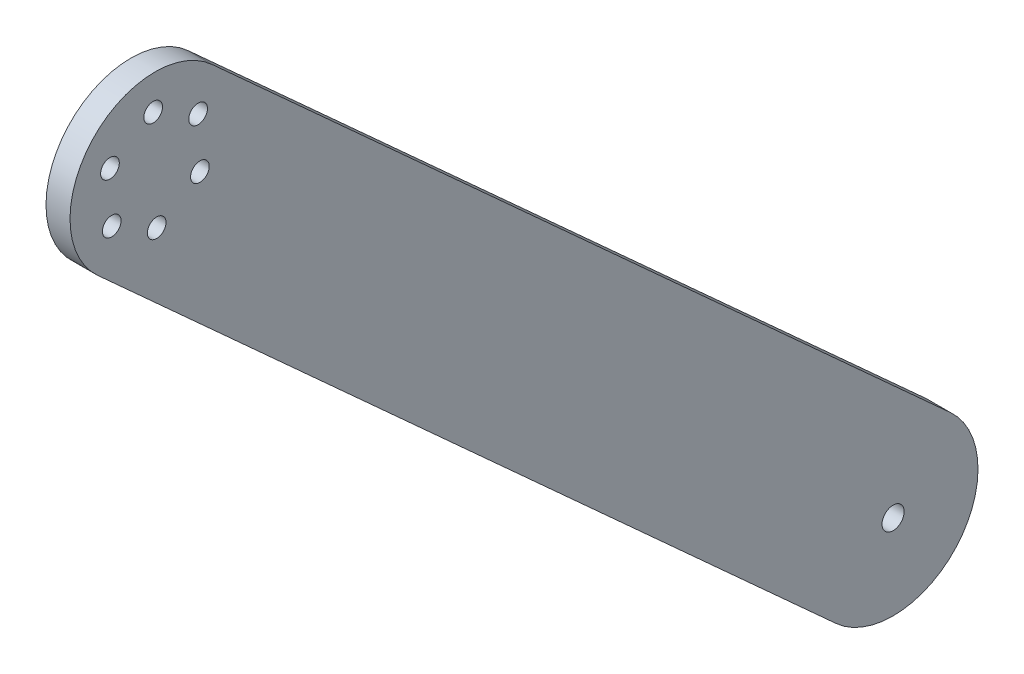
ISO-10303-21;
HEADER;
FILE_DESCRIPTION(('STEP AP214'),'2;1');
FILE_NAME('part.step','',(''),(''),'','','');
FILE_SCHEMA(('AUTOMOTIVE_DESIGN { 1 0 10303 214 1 1 1 1 }'));
ENDSEC;
DATA;
#1=APPLICATION_CONTEXT('core data for automotive mechanical design processes');
#2=APPLICATION_PROTOCOL_DEFINITION('international standard','automotive_design',2000,#1);
#3=PRODUCT_CONTEXT('',#1,'mechanical');
#4=PRODUCT('Part','Part','',(#3));
#5=PRODUCT_RELATED_PRODUCT_CATEGORY('part','',(#4));
#6=PRODUCT_DEFINITION_FORMATION('','',#4);
#7=PRODUCT_DEFINITION_CONTEXT('part definition',#1,'design');
#8=PRODUCT_DEFINITION('design','',#6,#7);
#9=PRODUCT_DEFINITION_SHAPE('','',#8);
#10=(LENGTH_UNIT() NAMED_UNIT(*) SI_UNIT(.MILLI.,.METRE.));
#11=(NAMED_UNIT(*) PLANE_ANGLE_UNIT() SI_UNIT($,.RADIAN.));
#12=(NAMED_UNIT(*) SI_UNIT($,.STERADIAN.) SOLID_ANGLE_UNIT());
#13=UNCERTAINTY_MEASURE_WITH_UNIT(LENGTH_MEASURE(1.E-05),#10,'distance_accuracy_value','');
#14=(GEOMETRIC_REPRESENTATION_CONTEXT(3) GLOBAL_UNCERTAINTY_ASSIGNED_CONTEXT((#13)) GLOBAL_UNIT_ASSIGNED_CONTEXT((#10,
#11,#12)) REPRESENTATION_CONTEXT('',''));
#15=CARTESIAN_POINT('',(0.,0.,0.));
#16=DIRECTION('',(0.,0.,1.));
#17=DIRECTION('',(1.,0.,0.));
#18=AXIS2_PLACEMENT_3D('',#15,#16,#17);
#19=CARTESIAN_POINT('',(5.661,78.9641500156706,86.9434615845416));
#20=DIRECTION('',(1.,0.,0.));
#21=DIRECTION('',(0.,0.,-1.));
#22=AXIS2_PLACEMENT_3D('',#19,#20,#21);
#23=PLANE('',#22);
#24=CARTESIAN_POINT('',(5.661,73.3262866783321,76.3503271574944));
#25=DIRECTION('',(1.,0.,0.));
#26=DIRECTION('',(0.,0.,-1.));
#27=AXIS2_PLACEMENT_3D('',#24,#25,#26);
#28=CIRCLE('',#27,2.2);
#29=CARTESIAN_POINT('',(5.661,73.3262866783321,74.1503271574944));
#30=VERTEX_POINT('',#29);
#31=EDGE_CURVE('E147',#30,#30,#28,.T.);
#32=ORIENTED_EDGE('',*,*,#31,.F.);
#33=EDGE_LOOP('',(#32));
#34=FACE_BOUND('',#33,.T.);
#35=CARTESIAN_POINT('',(5.661,90.9570052038663,87.3574959248652));
#36=DIRECTION('',(1.,0.,0.));
#37=DIRECTION('',(0.,0.,-1.));
#38=AXIS2_PLACEMENT_3D('',#35,#36,#37);
#39=CIRCLE('',#38,2.2);
#40=CARTESIAN_POINT('',(5.661,90.9570052038663,85.1574959248652));
#41=VERTEX_POINT('',#40);
#42=EDGE_CURVE('E135',#41,#41,#39,.T.);
#43=ORIENTED_EDGE('',*,*,#42,.F.);
#44=EDGE_LOOP('',(#43));
#45=FACE_BOUND('',#44,.T.);
#46=CARTESIAN_POINT('',(5.661,72.6091581648133,97.1225616712653));
#47=DIRECTION('',(1.,0.,0.));
#48=DIRECTION('',(0.,0.,-1.));
#49=AXIS2_PLACEMENT_3D('',#46,#47,#48);
#50=CIRCLE('',#49,2.2);
#51=CARTESIAN_POINT('',(5.661,72.6091581648133,94.9225616712653));
#52=VERTEX_POINT('',#51);
#53=EDGE_CURVE('E123',#52,#52,#50,.T.);
#54=ORIENTED_EDGE('',*,*,#53,.F.);
#55=EDGE_LOOP('',(#54));
#56=FACE_BOUND('',#55,.T.);
#57=CARTESIAN_POINT('',(5.661,78.9641500156706,86.9434615845416));
#58=DIRECTION('',(1.,0.,0.));
#59=DIRECTION('',(0.,0.,-1.));
#60=AXIS2_PLACEMENT_3D('',#57,#58,#59);
#61=CIRCLE('',#60,20.);
#62=CARTESIAN_POINT('',(5.661,93.7693371735321,73.4970333145254));
#63=VERTEX_POINT('',#62);
#64=CARTESIAN_POINT('',(5.661,64.158962857809,100.389889854558));
#65=VERTEX_POINT('',#64);
#66=EDGE_CURVE('E93',#63,#65,#61,.T.);
#67=ORIENTED_EDGE('',*,*,#66,.T.);
#68=DIRECTION('',(0.,-0.672321413500814,-0.740259357893075));
#69=VECTOR('',#68,1.);
#70=CARTESIAN_POINT('',(5.661,64.158962857809,100.389889854558));
#71=LINE('',#70,#69);
#72=CARTESIAN_POINT('',(5.661,-93.769337173532,-73.4970333145254));
#73=VERTEX_POINT('',#72);
#74=EDGE_CURVE('E88',#65,#73,#71,.T.);
#75=ORIENTED_EDGE('',*,*,#74,.T.);
#76=CARTESIAN_POINT('',(5.661,-78.9641500156705,-86.9434615845417));
#77=DIRECTION('',(1.,0.,0.));
#78=DIRECTION('',(0.,0.,-1.));
#79=AXIS2_PLACEMENT_3D('',#76,#77,#78);
#80=CIRCLE('',#79,20.);
#81=CARTESIAN_POINT('',(5.661,-64.1589628578091,-100.389889854558));
#82=VERTEX_POINT('',#81);
#83=EDGE_CURVE('E91',#73,#82,#80,.T.);
#84=ORIENTED_EDGE('',*,*,#83,.T.);
#85=DIRECTION('',(0.,0.672321413500814,0.740259357893075));
#86=VECTOR('',#85,1.);
#87=CARTESIAN_POINT('',(5.661,93.7693371735321,73.4970333145254));
#88=LINE('',#87,#86);
#89=EDGE_CURVE('E58',#82,#63,#88,.T.);
#90=ORIENTED_EDGE('',*,*,#89,.T.);
#91=EDGE_LOOP('',(#67,#75,#84,#90));
#92=FACE_BOUND('',#91,.T.);
#93=CARTESIAN_POINT('',(5.661,-78.9641500156705,-86.9434615845417));
#94=DIRECTION('',(1.,0.,0.));
#95=DIRECTION('',(0.,0.,-1.));
#96=AXIS2_PLACEMENT_3D('',#93,#94,#95);
#97=CIRCLE('',#96,2.60670000000001);
#98=CARTESIAN_POINT('',(5.661,-78.9641500156705,-89.5501615845417));
#99=VERTEX_POINT('',#98);
#100=EDGE_CURVE('E108',#99,#99,#97,.T.);
#101=ORIENTED_EDGE('',*,*,#100,.F.);
#102=EDGE_LOOP('',(#101));
#103=FACE_BOUND('',#102,.T.);
#104=CARTESIAN_POINT('',(5.661,84.602013353009,97.5365960115889));
#105=DIRECTION('',(1.,0.,0.));
#106=DIRECTION('',(0.,0.,-1.));
#107=AXIS2_PLACEMENT_3D('',#104,#105,#106);
#108=CIRCLE('',#107,2.2);
#109=CARTESIAN_POINT('',(5.661,84.602013353009,95.3365960115889));
#110=VERTEX_POINT('',#109);
#111=EDGE_CURVE('E129',#110,#110,#108,.T.);
#112=ORIENTED_EDGE('',*,*,#111,.F.);
#113=EDGE_LOOP('',(#112));
#114=FACE_BOUND('',#113,.T.);
#115=CARTESIAN_POINT('',(5.661,85.3191418665278,76.7643614978179));
#116=DIRECTION('',(1.,0.,0.));
#117=DIRECTION('',(0.,0.,-1.));
#118=AXIS2_PLACEMENT_3D('',#115,#116,#117);
#119=CIRCLE('',#118,2.2);
#120=CARTESIAN_POINT('',(5.661,85.3191418665278,74.5643614978179));
#121=VERTEX_POINT('',#120);
#122=EDGE_CURVE('E141',#121,#121,#119,.T.);
#123=ORIENTED_EDGE('',*,*,#122,.F.);
#124=EDGE_LOOP('',(#123));
#125=FACE_BOUND('',#124,.T.);
#126=CARTESIAN_POINT('',(5.661,66.9712948274749,86.5294272442181));
#127=DIRECTION('',(1.,0.,0.));
#128=DIRECTION('',(0.,0.,-1.));
#129=AXIS2_PLACEMENT_3D('',#126,#127,#128);
#130=CIRCLE('',#129,2.2);
#131=CARTESIAN_POINT('',(5.661,66.9712948274749,84.3294272442181));
#132=VERTEX_POINT('',#131);
#133=EDGE_CURVE('E153',#132,#132,#130,.T.);
#134=ORIENTED_EDGE('',*,*,#133,.F.);
#135=EDGE_LOOP('',(#134));
#136=FACE_BOUND('',#135,.T.);
#137=ADVANCED_FACE('F41',(#34,#45,#56,#92,#103,#114,#125,#136),#23,.T.);
#138=CARTESIAN_POINT('',(0.,78.9641500156706,86.9434615845416));
#139=DIRECTION('',(1.,0.,0.));
#140=DIRECTION('',(0.,0.,-1.));
#141=AXIS2_PLACEMENT_3D('',#138,#139,#140);
#142=PLANE('',#141);
#143=CARTESIAN_POINT('',(0.,78.9641500156706,86.9434615845416));
#144=DIRECTION('',(1.,0.,0.));
#145=DIRECTION('',(0.,0.,-1.));
#146=AXIS2_PLACEMENT_3D('',#143,#144,#145);
#147=CIRCLE('',#146,20.);
#148=CARTESIAN_POINT('',(0.,93.7693371735321,73.4970333145254));
#149=VERTEX_POINT('',#148);
#150=CARTESIAN_POINT('',(0.,64.158962857809,100.389889854558));
#151=VERTEX_POINT('',#150);
#152=EDGE_CURVE('E105',#149,#151,#147,.T.);
#153=ORIENTED_EDGE('',*,*,#152,.F.);
#154=DIRECTION('',(0.,0.672321413500814,0.740259357893075));
#155=VECTOR('',#154,1.);
#156=CARTESIAN_POINT('',(0.,93.7693371735321,73.4970333145254));
#157=LINE('',#156,#155);
#158=CARTESIAN_POINT('',(0.,-64.1589628578091,-100.389889854558));
#159=VERTEX_POINT('',#158);
#160=EDGE_CURVE('E81',#159,#149,#157,.T.);
#161=ORIENTED_EDGE('',*,*,#160,.F.);
#162=CARTESIAN_POINT('',(0.,-78.9641500156705,-86.9434615845417));
#163=DIRECTION('',(1.,0.,0.));
#164=DIRECTION('',(0.,0.,-1.));
#165=AXIS2_PLACEMENT_3D('',#162,#163,#164);
#166=CIRCLE('',#165,20.);
#167=CARTESIAN_POINT('',(0.,-93.769337173532,-73.4970333145254));
#168=VERTEX_POINT('',#167);
#169=EDGE_CURVE('E75',#168,#159,#166,.T.);
#170=ORIENTED_EDGE('',*,*,#169,.F.);
#171=DIRECTION('',(0.,-0.672321413500814,-0.740259357893075));
#172=VECTOR('',#171,1.);
#173=CARTESIAN_POINT('',(0.,64.158962857809,100.389889854558));
#174=LINE('',#173,#172);
#175=EDGE_CURVE('E97',#151,#168,#174,.T.);
#176=ORIENTED_EDGE('',*,*,#175,.F.);
#177=EDGE_LOOP('',(#153,#161,#170,#176));
#178=FACE_BOUND('',#177,.T.);
#179=CARTESIAN_POINT('',(0.,-78.9641500156705,-86.9434615845417));
#180=DIRECTION('',(1.,0.,0.));
#181=DIRECTION('',(0.,0.,-1.));
#182=AXIS2_PLACEMENT_3D('',#179,#180,#181);
#183=CIRCLE('',#182,2.60670000000001);
#184=CARTESIAN_POINT('',(0.,-78.9641500156705,-89.5501615845417));
#185=VERTEX_POINT('',#184);
#186=EDGE_CURVE('E120',#185,#185,#183,.T.);
#187=ORIENTED_EDGE('',*,*,#186,.T.);
#188=EDGE_LOOP('',(#187));
#189=FACE_BOUND('',#188,.T.);
#190=CARTESIAN_POINT('',(0.,72.6091581648133,97.1225616712653));
#191=DIRECTION('',(1.,0.,0.));
#192=DIRECTION('',(0.,0.,-1.));
#193=AXIS2_PLACEMENT_3D('',#190,#191,#192);
#194=CIRCLE('',#193,2.2);
#195=CARTESIAN_POINT('',(0.,72.6091581648133,94.9225616712653));
#196=VERTEX_POINT('',#195);
#197=EDGE_CURVE('E126',#196,#196,#194,.T.);
#198=ORIENTED_EDGE('',*,*,#197,.T.);
#199=EDGE_LOOP('',(#198));
#200=FACE_BOUND('',#199,.T.);
#201=CARTESIAN_POINT('',(0.,84.602013353009,97.5365960115889));
#202=DIRECTION('',(1.,0.,0.));
#203=DIRECTION('',(0.,0.,-1.));
#204=AXIS2_PLACEMENT_3D('',#201,#202,#203);
#205=CIRCLE('',#204,2.2);
#206=CARTESIAN_POINT('',(0.,84.602013353009,95.3365960115889));
#207=VERTEX_POINT('',#206);
#208=EDGE_CURVE('E132',#207,#207,#205,.T.);
#209=ORIENTED_EDGE('',*,*,#208,.T.);
#210=EDGE_LOOP('',(#209));
#211=FACE_BOUND('',#210,.T.);
#212=CARTESIAN_POINT('',(0.,90.9570052038663,87.3574959248652));
#213=DIRECTION('',(1.,0.,0.));
#214=DIRECTION('',(0.,0.,-1.));
#215=AXIS2_PLACEMENT_3D('',#212,#213,#214);
#216=CIRCLE('',#215,2.2);
#217=CARTESIAN_POINT('',(0.,90.9570052038663,85.1574959248652));
#218=VERTEX_POINT('',#217);
#219=EDGE_CURVE('E138',#218,#218,#216,.T.);
#220=ORIENTED_EDGE('',*,*,#219,.T.);
#221=EDGE_LOOP('',(#220));
#222=FACE_BOUND('',#221,.T.);
#223=CARTESIAN_POINT('',(0.,85.3191418665278,76.7643614978179));
#224=DIRECTION('',(1.,0.,0.));
#225=DIRECTION('',(0.,0.,-1.));
#226=AXIS2_PLACEMENT_3D('',#223,#224,#225);
#227=CIRCLE('',#226,2.2);
#228=CARTESIAN_POINT('',(0.,85.3191418665278,74.5643614978179));
#229=VERTEX_POINT('',#228);
#230=EDGE_CURVE('E144',#229,#229,#227,.T.);
#231=ORIENTED_EDGE('',*,*,#230,.T.);
#232=EDGE_LOOP('',(#231));
#233=FACE_BOUND('',#232,.T.);
#234=CARTESIAN_POINT('',(0.,73.3262866783321,76.3503271574944));
#235=DIRECTION('',(1.,0.,0.));
#236=DIRECTION('',(0.,0.,-1.));
#237=AXIS2_PLACEMENT_3D('',#234,#235,#236);
#238=CIRCLE('',#237,2.2);
#239=CARTESIAN_POINT('',(0.,73.3262866783321,74.1503271574944));
#240=VERTEX_POINT('',#239);
#241=EDGE_CURVE('E150',#240,#240,#238,.T.);
#242=ORIENTED_EDGE('',*,*,#241,.T.);
#243=EDGE_LOOP('',(#242));
#244=FACE_BOUND('',#243,.T.);
#245=CARTESIAN_POINT('',(0.,66.9712948274749,86.5294272442181));
#246=DIRECTION('',(1.,0.,0.));
#247=DIRECTION('',(0.,0.,-1.));
#248=AXIS2_PLACEMENT_3D('',#245,#246,#247);
#249=CIRCLE('',#248,2.2);
#250=CARTESIAN_POINT('',(0.,66.9712948274749,84.3294272442181));
#251=VERTEX_POINT('',#250);
#252=EDGE_CURVE('E156',#251,#251,#249,.T.);
#253=ORIENTED_EDGE('',*,*,#252,.T.);
#254=EDGE_LOOP('',(#253));
#255=FACE_BOUND('',#254,.T.);
#256=ADVANCED_FACE('F116',(#178,#189,#200,#211,#222,#233,#244,#255),#142,.F.);
#257=CARTESIAN_POINT('',(5.661,78.9641500156706,86.9434615845416));
#258=DIRECTION('',(-1.,0.,0.));
#259=DIRECTION('',(0.,0.,1.));
#260=AXIS2_PLACEMENT_3D('',#257,#258,#259);
#261=CYLINDRICAL_SURFACE('',#260,20.);
#262=ORIENTED_EDGE('',*,*,#152,.T.);
#263=DIRECTION('',(-1.,0.,0.));
#264=VECTOR('',#263,1.);
#265=CARTESIAN_POINT('',(5.661,64.158962857809,100.389889854558));
#266=LINE('',#265,#264);
#267=EDGE_CURVE('E11',#65,#151,#266,.T.);
#268=ORIENTED_EDGE('',*,*,#267,.F.);
#269=ORIENTED_EDGE('',*,*,#66,.F.);
#270=DIRECTION('',(-1.,0.,0.));
#271=VECTOR('',#270,1.);
#272=CARTESIAN_POINT('',(5.661,93.7693371735321,73.4970333145254));
#273=LINE('',#272,#271);
#274=EDGE_CURVE('E101',#63,#149,#273,.T.);
#275=ORIENTED_EDGE('',*,*,#274,.T.);
#276=EDGE_LOOP('',(#262,#268,#269,#275));
#277=FACE_BOUND('',#276,.T.);
#278=ADVANCED_FACE('F43',(#277),#261,.T.);
#279=CARTESIAN_POINT('',(5.661,64.158962857809,100.389889854558));
#280=DIRECTION('',(0.,0.740259357893075,-0.672321413500814));
#281=DIRECTION('',(0.,0.672321413500814,0.740259357893075));
#282=AXIS2_PLACEMENT_3D('',#279,#280,#281);
#283=PLANE('',#282);
#284=ORIENTED_EDGE('',*,*,#175,.T.);
#285=DIRECTION('',(-1.,0.,0.));
#286=VECTOR('',#285,1.);
#287=CARTESIAN_POINT('',(5.661,-93.769337173532,-73.4970333145254));
#288=LINE('',#287,#286);
#289=EDGE_CURVE('E50',#73,#168,#288,.T.);
#290=ORIENTED_EDGE('',*,*,#289,.F.);
#291=ORIENTED_EDGE('',*,*,#74,.F.);
#292=ORIENTED_EDGE('',*,*,#267,.T.);
#293=EDGE_LOOP('',(#284,#290,#291,#292));
#294=FACE_BOUND('',#293,.T.);
#295=ADVANCED_FACE('F96',(#294),#283,.F.);
#296=CARTESIAN_POINT('',(5.661,-78.9641500156705,-86.9434615845417));
#297=DIRECTION('',(-1.,0.,0.));
#298=DIRECTION('',(0.,0.,1.));
#299=AXIS2_PLACEMENT_3D('',#296,#297,#298);
#300=CYLINDRICAL_SURFACE('',#299,20.);
#301=ORIENTED_EDGE('',*,*,#169,.T.);
#302=DIRECTION('',(-1.,0.,0.));
#303=VECTOR('',#302,1.);
#304=CARTESIAN_POINT('',(5.661,-64.1589628578091,-100.389889854558));
#305=LINE('',#304,#303);
#306=EDGE_CURVE('E98',#82,#159,#305,.T.);
#307=ORIENTED_EDGE('',*,*,#306,.F.);
#308=ORIENTED_EDGE('',*,*,#83,.F.);
#309=ORIENTED_EDGE('',*,*,#289,.T.);
#310=EDGE_LOOP('',(#301,#307,#308,#309));
#311=FACE_BOUND('',#310,.T.);
#312=ADVANCED_FACE('F99',(#311),#300,.T.);
#313=CARTESIAN_POINT('',(5.661,93.7693371735321,73.4970333145254));
#314=DIRECTION('',(0.,-0.740259357893075,0.672321413500814));
#315=DIRECTION('',(0.,-0.672321413500814,-0.740259357893075));
#316=AXIS2_PLACEMENT_3D('',#313,#314,#315);
#317=PLANE('',#316);
#318=ORIENTED_EDGE('',*,*,#160,.T.);
#319=ORIENTED_EDGE('',*,*,#274,.F.);
#320=ORIENTED_EDGE('',*,*,#89,.F.);
#321=ORIENTED_EDGE('',*,*,#306,.T.);
#322=EDGE_LOOP('',(#318,#319,#320,#321));
#323=FACE_BOUND('',#322,.T.);
#324=ADVANCED_FACE('F113',(#323),#317,.F.);
#325=CARTESIAN_POINT('',(5.661,-78.9641500156705,-86.9434615845417));
#326=DIRECTION('',(-1.,0.,0.));
#327=DIRECTION('',(0.,0.,1.));
#328=AXIS2_PLACEMENT_3D('',#325,#326,#327);
#329=CYLINDRICAL_SURFACE('',#328,2.60670000000001);
#330=ORIENTED_EDGE('',*,*,#100,.T.);
#331=EDGE_LOOP('',(#330));
#332=FACE_BOUND('',#331,.T.);
#333=ORIENTED_EDGE('',*,*,#186,.F.);
#334=EDGE_LOOP('',(#333));
#335=FACE_BOUND('',#334,.T.);
#336=ADVANCED_FACE('F175',(#332,#335),#329,.F.);
#337=CARTESIAN_POINT('',(5.661,72.6091581648133,97.1225616712653));
#338=DIRECTION('',(-1.,0.,0.));
#339=DIRECTION('',(0.,0.,1.));
#340=AXIS2_PLACEMENT_3D('',#337,#338,#339);
#341=CYLINDRICAL_SURFACE('',#340,2.2);
#342=ORIENTED_EDGE('',*,*,#53,.T.);
#343=EDGE_LOOP('',(#342));
#344=FACE_BOUND('',#343,.T.);
#345=ORIENTED_EDGE('',*,*,#197,.F.);
#346=EDGE_LOOP('',(#345));
#347=FACE_BOUND('',#346,.T.);
#348=ADVANCED_FACE('F220',(#344,#347),#341,.F.);
#349=CARTESIAN_POINT('',(5.661,84.602013353009,97.5365960115889));
#350=DIRECTION('',(-1.,0.,0.));
#351=DIRECTION('',(0.,0.,1.));
#352=AXIS2_PLACEMENT_3D('',#349,#350,#351);
#353=CYLINDRICAL_SURFACE('',#352,2.2);
#354=ORIENTED_EDGE('',*,*,#111,.T.);
#355=EDGE_LOOP('',(#354));
#356=FACE_BOUND('',#355,.T.);
#357=ORIENTED_EDGE('',*,*,#208,.F.);
#358=EDGE_LOOP('',(#357));
#359=FACE_BOUND('',#358,.T.);
#360=ADVANCED_FACE('F228',(#356,#359),#353,.F.);
#361=CARTESIAN_POINT('',(5.661,90.9570052038663,87.3574959248652));
#362=DIRECTION('',(-1.,0.,0.));
#363=DIRECTION('',(0.,0.,1.));
#364=AXIS2_PLACEMENT_3D('',#361,#362,#363);
#365=CYLINDRICAL_SURFACE('',#364,2.2);
#366=ORIENTED_EDGE('',*,*,#42,.T.);
#367=EDGE_LOOP('',(#366));
#368=FACE_BOUND('',#367,.T.);
#369=ORIENTED_EDGE('',*,*,#219,.F.);
#370=EDGE_LOOP('',(#369));
#371=FACE_BOUND('',#370,.T.);
#372=ADVANCED_FACE('F236',(#368,#371),#365,.F.);
#373=CARTESIAN_POINT('',(5.661,85.3191418665278,76.7643614978179));
#374=DIRECTION('',(-1.,0.,0.));
#375=DIRECTION('',(0.,0.,1.));
#376=AXIS2_PLACEMENT_3D('',#373,#374,#375);
#377=CYLINDRICAL_SURFACE('',#376,2.2);
#378=ORIENTED_EDGE('',*,*,#122,.T.);
#379=EDGE_LOOP('',(#378));
#380=FACE_BOUND('',#379,.T.);
#381=ORIENTED_EDGE('',*,*,#230,.F.);
#382=EDGE_LOOP('',(#381));
#383=FACE_BOUND('',#382,.T.);
#384=ADVANCED_FACE('F245',(#380,#383),#377,.F.);
#385=CARTESIAN_POINT('',(5.661,73.3262866783321,76.3503271574944));
#386=DIRECTION('',(-1.,0.,0.));
#387=DIRECTION('',(0.,0.,1.));
#388=AXIS2_PLACEMENT_3D('',#385,#386,#387);
#389=CYLINDRICAL_SURFACE('',#388,2.2);
#390=ORIENTED_EDGE('',*,*,#31,.T.);
#391=EDGE_LOOP('',(#390));
#392=FACE_BOUND('',#391,.T.);
#393=ORIENTED_EDGE('',*,*,#241,.F.);
#394=EDGE_LOOP('',(#393));
#395=FACE_BOUND('',#394,.T.);
#396=ADVANCED_FACE('F254',(#392,#395),#389,.F.);
#397=CARTESIAN_POINT('',(5.661,66.9712948274749,86.5294272442181));
#398=DIRECTION('',(-1.,0.,0.));
#399=DIRECTION('',(0.,0.,1.));
#400=AXIS2_PLACEMENT_3D('',#397,#398,#399);
#401=CYLINDRICAL_SURFACE('',#400,2.2);
#402=ORIENTED_EDGE('',*,*,#133,.T.);
#403=EDGE_LOOP('',(#402));
#404=FACE_BOUND('',#403,.T.);
#405=ORIENTED_EDGE('',*,*,#252,.F.);
#406=EDGE_LOOP('',(#405));
#407=FACE_BOUND('',#406,.T.);
#408=ADVANCED_FACE('F162',(#404,#407),#401,.F.);
#409=CLOSED_SHELL('',(#137,#256,#278,#295,#312,#324,#336,#348,#360,#372,#384,#396,#408));
#410=MANIFOLD_SOLID_BREP('B2',#409);
#411=ADVANCED_BREP_SHAPE_REPRESENTATION('',(#18,#410),#14);
#412=SHAPE_DEFINITION_REPRESENTATION(#9,#411);
ENDSEC;
END-ISO-10303-21;
